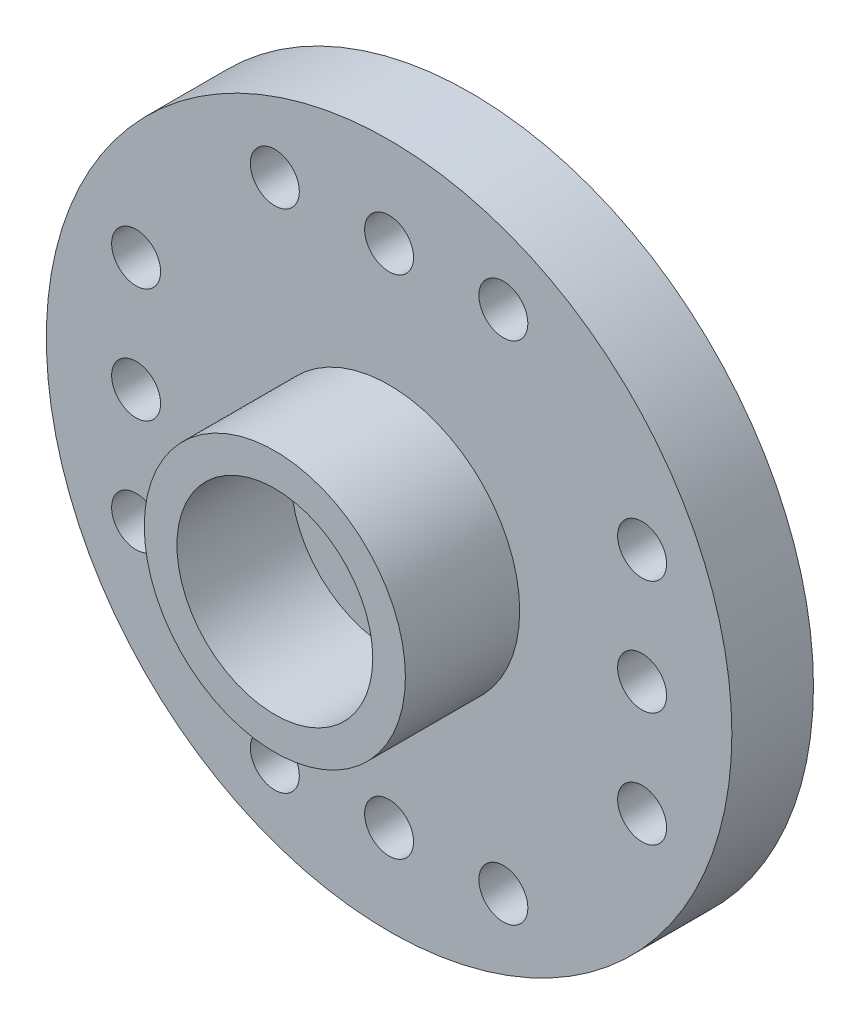
ISO-10303-21;
HEADER;
FILE_DESCRIPTION(('STEP AP214'),'2;1');
FILE_NAME('part.step','',(''),(''),'','','');
FILE_SCHEMA(('AUTOMOTIVE_DESIGN { 1 0 10303 214 1 1 1 1 }'));
ENDSEC;
DATA;
#1=APPLICATION_CONTEXT('core data for automotive mechanical design processes');
#2=APPLICATION_PROTOCOL_DEFINITION('international standard','automotive_design',2000,#1);
#3=PRODUCT_CONTEXT('',#1,'mechanical');
#4=PRODUCT('Part','Part','',(#3));
#5=PRODUCT_RELATED_PRODUCT_CATEGORY('part','',(#4));
#6=PRODUCT_DEFINITION_FORMATION('','',#4);
#7=PRODUCT_DEFINITION_CONTEXT('part definition',#1,'design');
#8=PRODUCT_DEFINITION('design','',#6,#7);
#9=PRODUCT_DEFINITION_SHAPE('','',#8);
#10=(LENGTH_UNIT() NAMED_UNIT(*) SI_UNIT(.MILLI.,.METRE.));
#11=(NAMED_UNIT(*) PLANE_ANGLE_UNIT() SI_UNIT($,.RADIAN.));
#12=(NAMED_UNIT(*) SI_UNIT($,.STERADIAN.) SOLID_ANGLE_UNIT());
#13=UNCERTAINTY_MEASURE_WITH_UNIT(LENGTH_MEASURE(1.E-05),#10,'distance_accuracy_value','');
#14=(GEOMETRIC_REPRESENTATION_CONTEXT(3) GLOBAL_UNCERTAINTY_ASSIGNED_CONTEXT((#13)) GLOBAL_UNIT_ASSIGNED_CONTEXT((#10,
#11,#12)) REPRESENTATION_CONTEXT('',''));
#15=CARTESIAN_POINT('',(0.,0.,0.));
#16=DIRECTION('',(0.,0.,1.));
#17=DIRECTION('',(1.,0.,0.));
#18=AXIS2_PLACEMENT_3D('',#15,#16,#17);
#19=CARTESIAN_POINT('',(0.,0.,2.5));
#20=DIRECTION('',(0.,0.,1.));
#21=DIRECTION('',(1.,0.,0.));
#22=AXIS2_PLACEMENT_3D('',#19,#20,#21);
#23=PLANE('',#22);
#24=CARTESIAN_POINT('',(3.50000000000032,-7.74999999999988,2.5));
#25=DIRECTION('',(0.,0.,1.));
#26=DIRECTION('',(1.,0.,0.));
#27=AXIS2_PLACEMENT_3D('',#24,#25,#26);
#28=CIRCLE('',#27,0.749999999999969);
#29=CARTESIAN_POINT('',(4.25000000000029,-7.74999999999988,2.5));
#30=VERTEX_POINT('',#29);
#31=EDGE_CURVE('E99',#30,#30,#28,.T.);
#32=ORIENTED_EDGE('',*,*,#31,.F.);
#33=EDGE_LOOP('',(#32));
#34=FACE_BOUND('',#33,.T.);
#35=CARTESIAN_POINT('',(-3.49999999999968,-7.74999999999988,2.5));
#36=DIRECTION('',(0.,0.,1.));
#37=DIRECTION('',(1.,0.,0.));
#38=AXIS2_PLACEMENT_3D('',#35,#36,#37);
#39=CIRCLE('',#38,0.75000000000004);
#40=CARTESIAN_POINT('',(-2.74999999999964,-7.74999999999988,2.5));
#41=VERTEX_POINT('',#40);
#42=EDGE_CURVE('E89',#41,#41,#39,.T.);
#43=ORIENTED_EDGE('',*,*,#42,.F.);
#44=EDGE_LOOP('',(#43));
#45=FACE_BOUND('',#44,.T.);
#46=CARTESIAN_POINT('',(3.18526106670121E-13,-7.74999999999988,2.5));
#47=DIRECTION('',(0.,0.,1.));
#48=DIRECTION('',(1.,0.,0.));
#49=AXIS2_PLACEMENT_3D('',#46,#47,#48);
#50=CIRCLE('',#49,0.750000000000005);
#51=CARTESIAN_POINT('',(0.750000000000323,-7.74999999999988,2.5));
#52=VERTEX_POINT('',#51);
#53=EDGE_CURVE('E86',#52,#52,#50,.T.);
#54=ORIENTED_EDGE('',*,*,#53,.F.);
#55=EDGE_LOOP('',(#54));
#56=FACE_BOUND('',#55,.T.);
#57=CARTESIAN_POINT('',(7.7500000000002,3.50000000000043,2.5));
#58=DIRECTION('',(0.,0.,1.));
#59=DIRECTION('',(1.,0.,0.));
#60=AXIS2_PLACEMENT_3D('',#57,#58,#59);
#61=CIRCLE('',#60,0.750000000000311);
#62=CARTESIAN_POINT('',(8.50000000000051,3.50000000000043,2.5));
#63=VERTEX_POINT('',#62);
#64=EDGE_CURVE('E83',#63,#63,#61,.T.);
#65=ORIENTED_EDGE('',*,*,#64,.F.);
#66=EDGE_LOOP('',(#65));
#67=FACE_BOUND('',#66,.T.);
#68=CARTESIAN_POINT('',(7.7500000000002,-3.49999999999957,2.5));
#69=DIRECTION('',(0.,0.,1.));
#70=DIRECTION('',(1.,0.,0.));
#71=AXIS2_PLACEMENT_3D('',#68,#69,#70);
#72=CIRCLE('',#71,0.750000000000357);
#73=CARTESIAN_POINT('',(8.50000000000056,-3.49999999999957,2.5));
#74=VERTEX_POINT('',#73);
#75=EDGE_CURVE('E79',#74,#74,#72,.T.);
#76=ORIENTED_EDGE('',*,*,#75,.F.);
#77=EDGE_LOOP('',(#76));
#78=FACE_BOUND('',#77,.T.);
#79=CARTESIAN_POINT('',(7.7500000000002,4.34711709794892E-13,2.5));
#80=DIRECTION('',(0.,0.,1.));
#81=DIRECTION('',(1.,0.,0.));
#82=AXIS2_PLACEMENT_3D('',#79,#80,#81);
#83=CIRCLE('',#82,0.750000000000334);
#84=CARTESIAN_POINT('',(8.50000000000053,4.34711709794892E-13,2.5));
#85=VERTEX_POINT('',#84);
#86=EDGE_CURVE('E75',#85,#85,#83,.T.);
#87=ORIENTED_EDGE('',*,*,#86,.F.);
#88=EDGE_LOOP('',(#87));
#89=FACE_BOUND('',#88,.T.);
#90=CARTESIAN_POINT('',(-3.50000000000012,7.75000000000032,2.5));
#91=DIRECTION('',(0.,0.,1.));
#92=DIRECTION('',(1.,0.,0.));
#93=AXIS2_PLACEMENT_3D('',#90,#91,#92);
#94=CIRCLE('',#93,0.750000000000333);
#95=CARTESIAN_POINT('',(-2.74999999999979,7.75000000000032,2.5));
#96=VERTEX_POINT('',#95);
#97=EDGE_CURVE('E71',#96,#96,#94,.T.);
#98=ORIENTED_EDGE('',*,*,#97,.F.);
#99=EDGE_LOOP('',(#98));
#100=FACE_BOUND('',#99,.T.);
#101=CARTESIAN_POINT('',(3.49999999999988,7.75000000000032,2.5));
#102=DIRECTION('',(0.,0.,1.));
#103=DIRECTION('',(1.,0.,0.));
#104=AXIS2_PLACEMENT_3D('',#101,#102,#103);
#105=CIRCLE('',#104,0.750000000000357);
#106=CARTESIAN_POINT('',(4.25000000000024,7.75000000000032,2.5));
#107=VERTEX_POINT('',#106);
#108=EDGE_CURVE('E67',#107,#107,#105,.T.);
#109=ORIENTED_EDGE('',*,*,#108,.F.);
#110=EDGE_LOOP('',(#109));
#111=FACE_BOUND('',#110,.T.);
#112=CARTESIAN_POINT('',(-1.18083805663449E-13,7.75000000000032,2.5));
#113=DIRECTION('',(0.,0.,1.));
#114=DIRECTION('',(1.,0.,0.));
#115=AXIS2_PLACEMENT_3D('',#112,#113,#114);
#116=CIRCLE('',#115,0.750000000000345);
#117=CARTESIAN_POINT('',(0.750000000000227,7.75000000000032,2.5));
#118=VERTEX_POINT('',#117);
#119=EDGE_CURVE('E63',#118,#118,#116,.T.);
#120=ORIENTED_EDGE('',*,*,#119,.F.);
#121=EDGE_LOOP('',(#120));
#122=FACE_BOUND('',#121,.T.);
#123=CARTESIAN_POINT('',(-7.75,-3.5,2.5));
#124=DIRECTION('',(0.,0.,1.));
#125=DIRECTION('',(1.,0.,0.));
#126=AXIS2_PLACEMENT_3D('',#123,#124,#125);
#127=CIRCLE('',#126,0.75);
#128=CARTESIAN_POINT('',(-7.,-3.5,2.5));
#129=VERTEX_POINT('',#128);
#130=EDGE_CURVE('E59',#129,#129,#127,.T.);
#131=ORIENTED_EDGE('',*,*,#130,.F.);
#132=EDGE_LOOP('',(#131));
#133=FACE_BOUND('',#132,.T.);
#134=CARTESIAN_POINT('',(-7.75,3.5,2.5));
#135=DIRECTION('',(0.,0.,1.));
#136=DIRECTION('',(1.,0.,0.));
#137=AXIS2_PLACEMENT_3D('',#134,#135,#136);
#138=CIRCLE('',#137,0.75);
#139=CARTESIAN_POINT('',(-7.,3.5,2.5));
#140=VERTEX_POINT('',#139);
#141=EDGE_CURVE('E55',#140,#140,#138,.T.);
#142=ORIENTED_EDGE('',*,*,#141,.F.);
#143=EDGE_LOOP('',(#142));
#144=FACE_BOUND('',#143,.T.);
#145=CARTESIAN_POINT('',(-7.75,0.,2.5));
#146=DIRECTION('',(0.,0.,1.));
#147=DIRECTION('',(1.,0.,0.));
#148=AXIS2_PLACEMENT_3D('',#145,#146,#147);
#149=CIRCLE('',#148,0.75);
#150=CARTESIAN_POINT('',(-7.,0.,2.5));
#151=VERTEX_POINT('',#150);
#152=EDGE_CURVE('E51',#151,#151,#149,.T.);
#153=ORIENTED_EDGE('',*,*,#152,.F.);
#154=EDGE_LOOP('',(#153));
#155=FACE_BOUND('',#154,.T.);
#156=CARTESIAN_POINT('',(0.,0.,2.5));
#157=DIRECTION('',(0.,0.,1.));
#158=DIRECTION('',(1.,0.,0.));
#159=AXIS2_PLACEMENT_3D('',#156,#157,#158);
#160=CIRCLE('',#159,10.5);
#161=CARTESIAN_POINT('',(10.5,0.,2.5));
#162=VERTEX_POINT('',#161);
#163=EDGE_CURVE('E38',#162,#162,#160,.T.);
#164=ORIENTED_EDGE('',*,*,#163,.T.);
#165=EDGE_LOOP('',(#164));
#166=FACE_BOUND('',#165,.T.);
#167=CARTESIAN_POINT('',(0.,0.,2.5));
#168=DIRECTION('',(0.,0.,1.));
#169=DIRECTION('',(1.,0.,0.));
#170=AXIS2_PLACEMENT_3D('',#167,#168,#169);
#171=CIRCLE('',#170,4.);
#172=CARTESIAN_POINT('',(4.,0.,2.5));
#173=VERTEX_POINT('',#172);
#174=EDGE_CURVE('E122',#173,#173,#171,.T.);
#175=ORIENTED_EDGE('',*,*,#174,.F.);
#176=EDGE_LOOP('',(#175));
#177=FACE_BOUND('',#176,.T.);
#178=ADVANCED_FACE('F30',(#34,#45,#56,#67,#78,#89,#100,#111,#122,#133,#144,#155,#166,#177),#23,.T.);
#179=CARTESIAN_POINT('',(0.,0.,2.5));
#180=DIRECTION('',(0.,0.,1.));
#181=DIRECTION('',(1.,0.,0.));
#182=AXIS2_PLACEMENT_3D('',#179,#180,#181);
#183=CIRCLE('',#182,3.);
#184=CARTESIAN_POINT('',(3.,0.,2.5));
#185=VERTEX_POINT('',#184);
#186=EDGE_CURVE('E10',#185,#185,#183,.F.);
#187=ORIENTED_EDGE('',*,*,#186,.F.);
#188=EDGE_LOOP('',(#187));
#189=FACE_BOUND('',#188,.T.);
#190=CARTESIAN_POINT('',(0.,0.,2.5));
#191=DIRECTION('',(0.,0.,1.));
#192=DIRECTION('',(1.,0.,0.));
#193=AXIS2_PLACEMENT_3D('',#190,#191,#192);
#194=CIRCLE('',#193,1.5);
#195=CARTESIAN_POINT('',(1.5,0.,2.5));
#196=VERTEX_POINT('',#195);
#197=EDGE_CURVE('E129',#196,#196,#194,.T.);
#198=ORIENTED_EDGE('',*,*,#197,.F.);
#199=EDGE_LOOP('',(#198));
#200=FACE_BOUND('',#199,.T.);
#201=ADVANCED_FACE('F153',(#189,#200),#23,.T.);
#202=CARTESIAN_POINT('',(0.,0.,0.));
#203=DIRECTION('',(0.,0.,1.));
#204=DIRECTION('',(1.,0.,0.));
#205=AXIS2_PLACEMENT_3D('',#202,#203,#204);
#206=PLANE('',#205);
#207=CARTESIAN_POINT('',(3.50000000000032,-7.74999999999988,0.));
#208=DIRECTION('',(0.,0.,1.));
#209=DIRECTION('',(1.,0.,0.));
#210=AXIS2_PLACEMENT_3D('',#207,#208,#209);
#211=CIRCLE('',#210,0.749999999999969);
#212=CARTESIAN_POINT('',(4.25000000000029,-7.74999999999988,0.));
#213=VERTEX_POINT('',#212);
#214=EDGE_CURVE('E34',#213,#213,#211,.T.);
#215=ORIENTED_EDGE('',*,*,#214,.T.);
#216=EDGE_LOOP('',(#215));
#217=FACE_BOUND('',#216,.T.);
#218=CARTESIAN_POINT('',(-3.49999999999968,-7.74999999999988,0.));
#219=DIRECTION('',(0.,0.,1.));
#220=DIRECTION('',(1.,0.,0.));
#221=AXIS2_PLACEMENT_3D('',#218,#219,#220);
#222=CIRCLE('',#221,0.75000000000004);
#223=CARTESIAN_POINT('',(-2.74999999999964,-7.74999999999988,0.));
#224=VERTEX_POINT('',#223);
#225=EDGE_CURVE('E87',#224,#224,#222,.T.);
#226=ORIENTED_EDGE('',*,*,#225,.T.);
#227=EDGE_LOOP('',(#226));
#228=FACE_BOUND('',#227,.T.);
#229=CARTESIAN_POINT('',(3.18526106670121E-13,-7.74999999999988,0.));
#230=DIRECTION('',(0.,0.,1.));
#231=DIRECTION('',(1.,0.,0.));
#232=AXIS2_PLACEMENT_3D('',#229,#230,#231);
#233=CIRCLE('',#232,0.750000000000005);
#234=CARTESIAN_POINT('',(0.750000000000323,-7.74999999999988,0.));
#235=VERTEX_POINT('',#234);
#236=EDGE_CURVE('E84',#235,#235,#233,.T.);
#237=ORIENTED_EDGE('',*,*,#236,.T.);
#238=EDGE_LOOP('',(#237));
#239=FACE_BOUND('',#238,.T.);
#240=CARTESIAN_POINT('',(7.7500000000002,3.50000000000043,0.));
#241=DIRECTION('',(0.,0.,1.));
#242=DIRECTION('',(1.,0.,0.));
#243=AXIS2_PLACEMENT_3D('',#240,#241,#242);
#244=CIRCLE('',#243,0.750000000000311);
#245=CARTESIAN_POINT('',(8.50000000000051,3.50000000000043,0.));
#246=VERTEX_POINT('',#245);
#247=EDGE_CURVE('E80',#246,#246,#244,.T.);
#248=ORIENTED_EDGE('',*,*,#247,.T.);
#249=EDGE_LOOP('',(#248));
#250=FACE_BOUND('',#249,.T.);
#251=CARTESIAN_POINT('',(7.7500000000002,-3.49999999999957,0.));
#252=DIRECTION('',(0.,0.,1.));
#253=DIRECTION('',(1.,0.,0.));
#254=AXIS2_PLACEMENT_3D('',#251,#252,#253);
#255=CIRCLE('',#254,0.750000000000357);
#256=CARTESIAN_POINT('',(8.50000000000056,-3.49999999999957,0.));
#257=VERTEX_POINT('',#256);
#258=EDGE_CURVE('E76',#257,#257,#255,.T.);
#259=ORIENTED_EDGE('',*,*,#258,.T.);
#260=EDGE_LOOP('',(#259));
#261=FACE_BOUND('',#260,.T.);
#262=CARTESIAN_POINT('',(7.7500000000002,4.34711709794892E-13,0.));
#263=DIRECTION('',(0.,0.,1.));
#264=DIRECTION('',(1.,0.,0.));
#265=AXIS2_PLACEMENT_3D('',#262,#263,#264);
#266=CIRCLE('',#265,0.750000000000334);
#267=CARTESIAN_POINT('',(8.50000000000053,4.34711709794892E-13,0.));
#268=VERTEX_POINT('',#267);
#269=EDGE_CURVE('E72',#268,#268,#266,.T.);
#270=ORIENTED_EDGE('',*,*,#269,.T.);
#271=EDGE_LOOP('',(#270));
#272=FACE_BOUND('',#271,.T.);
#273=CARTESIAN_POINT('',(-3.50000000000012,7.75000000000032,0.));
#274=DIRECTION('',(0.,0.,1.));
#275=DIRECTION('',(1.,0.,0.));
#276=AXIS2_PLACEMENT_3D('',#273,#274,#275);
#277=CIRCLE('',#276,0.750000000000333);
#278=CARTESIAN_POINT('',(-2.74999999999979,7.75000000000032,0.));
#279=VERTEX_POINT('',#278);
#280=EDGE_CURVE('E68',#279,#279,#277,.T.);
#281=ORIENTED_EDGE('',*,*,#280,.T.);
#282=EDGE_LOOP('',(#281));
#283=FACE_BOUND('',#282,.T.);
#284=CARTESIAN_POINT('',(3.49999999999988,7.75000000000032,0.));
#285=DIRECTION('',(0.,0.,1.));
#286=DIRECTION('',(1.,0.,0.));
#287=AXIS2_PLACEMENT_3D('',#284,#285,#286);
#288=CIRCLE('',#287,0.750000000000357);
#289=CARTESIAN_POINT('',(4.25000000000024,7.75000000000032,0.));
#290=VERTEX_POINT('',#289);
#291=EDGE_CURVE('E64',#290,#290,#288,.T.);
#292=ORIENTED_EDGE('',*,*,#291,.T.);
#293=EDGE_LOOP('',(#292));
#294=FACE_BOUND('',#293,.T.);
#295=CARTESIAN_POINT('',(-1.18083805663449E-13,7.75000000000032,0.));
#296=DIRECTION('',(0.,0.,1.));
#297=DIRECTION('',(1.,0.,0.));
#298=AXIS2_PLACEMENT_3D('',#295,#296,#297);
#299=CIRCLE('',#298,0.750000000000345);
#300=CARTESIAN_POINT('',(0.750000000000227,7.75000000000032,0.));
#301=VERTEX_POINT('',#300);
#302=EDGE_CURVE('E60',#301,#301,#299,.T.);
#303=ORIENTED_EDGE('',*,*,#302,.T.);
#304=EDGE_LOOP('',(#303));
#305=FACE_BOUND('',#304,.T.);
#306=CARTESIAN_POINT('',(-7.75,-3.5,0.));
#307=DIRECTION('',(0.,0.,1.));
#308=DIRECTION('',(1.,0.,0.));
#309=AXIS2_PLACEMENT_3D('',#306,#307,#308);
#310=CIRCLE('',#309,0.75);
#311=CARTESIAN_POINT('',(-7.,-3.5,0.));
#312=VERTEX_POINT('',#311);
#313=EDGE_CURVE('E56',#312,#312,#310,.T.);
#314=ORIENTED_EDGE('',*,*,#313,.T.);
#315=EDGE_LOOP('',(#314));
#316=FACE_BOUND('',#315,.T.);
#317=CARTESIAN_POINT('',(-7.75,3.5,0.));
#318=DIRECTION('',(0.,0.,1.));
#319=DIRECTION('',(1.,0.,0.));
#320=AXIS2_PLACEMENT_3D('',#317,#318,#319);
#321=CIRCLE('',#320,0.75);
#322=CARTESIAN_POINT('',(-7.,3.5,0.));
#323=VERTEX_POINT('',#322);
#324=EDGE_CURVE('E52',#323,#323,#321,.T.);
#325=ORIENTED_EDGE('',*,*,#324,.T.);
#326=EDGE_LOOP('',(#325));
#327=FACE_BOUND('',#326,.T.);
#328=CARTESIAN_POINT('',(-7.75,0.,0.));
#329=DIRECTION('',(0.,0.,1.));
#330=DIRECTION('',(1.,0.,0.));
#331=AXIS2_PLACEMENT_3D('',#328,#329,#330);
#332=CIRCLE('',#331,0.75);
#333=CARTESIAN_POINT('',(-7.,0.,0.));
#334=VERTEX_POINT('',#333);
#335=EDGE_CURVE('E47',#334,#334,#332,.T.);
#336=ORIENTED_EDGE('',*,*,#335,.T.);
#337=EDGE_LOOP('',(#336));
#338=FACE_BOUND('',#337,.T.);
#339=CARTESIAN_POINT('',(0.,0.,0.));
#340=DIRECTION('',(0.,0.,1.));
#341=DIRECTION('',(1.,0.,0.));
#342=AXIS2_PLACEMENT_3D('',#339,#340,#341);
#343=CIRCLE('',#342,10.5);
#344=CARTESIAN_POINT('',(10.5,0.,0.));
#345=VERTEX_POINT('',#344);
#346=EDGE_CURVE('E43',#345,#345,#343,.T.);
#347=ORIENTED_EDGE('',*,*,#346,.F.);
#348=EDGE_LOOP('',(#347));
#349=FACE_BOUND('',#348,.T.);
#350=CARTESIAN_POINT('',(0.,0.,0.));
#351=DIRECTION('',(0.,0.,1.));
#352=DIRECTION('',(1.,0.,0.));
#353=AXIS2_PLACEMENT_3D('',#350,#351,#352);
#354=CIRCLE('',#353,1.5);
#355=CARTESIAN_POINT('',(1.5,0.,0.));
#356=VERTEX_POINT('',#355);
#357=EDGE_CURVE('E126',#356,#356,#354,.T.);
#358=ORIENTED_EDGE('',*,*,#357,.T.);
#359=EDGE_LOOP('',(#358));
#360=FACE_BOUND('',#359,.T.);
#361=ADVANCED_FACE('F135',(#217,#228,#239,#250,#261,#272,#283,#294,#305,#316,#327,#338,#349,
#360),#206,.F.);
#362=CARTESIAN_POINT('',(0.,0.,2.5));
#363=DIRECTION('',(0.,0.,-1.));
#364=DIRECTION('',(-1.,0.,0.));
#365=AXIS2_PLACEMENT_3D('',#362,#363,#364);
#366=CYLINDRICAL_SURFACE('',#365,10.5);
#367=ORIENTED_EDGE('',*,*,#163,.F.);
#368=EDGE_LOOP('',(#367));
#369=FACE_BOUND('',#368,.T.);
#370=ORIENTED_EDGE('',*,*,#346,.T.);
#371=EDGE_LOOP('',(#370));
#372=FACE_BOUND('',#371,.T.);
#373=ADVANCED_FACE('F32',(#369,#372),#366,.T.);
#374=CARTESIAN_POINT('',(0.,0.,2.5));
#375=DIRECTION('',(0.,0.,-1.));
#376=DIRECTION('',(-1.,0.,0.));
#377=AXIS2_PLACEMENT_3D('',#374,#375,#376);
#378=CYLINDRICAL_SURFACE('',#377,1.5);
#379=ORIENTED_EDGE('',*,*,#197,.T.);
#380=EDGE_LOOP('',(#379));
#381=FACE_BOUND('',#380,.T.);
#382=ORIENTED_EDGE('',*,*,#357,.F.);
#383=EDGE_LOOP('',(#382));
#384=FACE_BOUND('',#383,.T.);
#385=ADVANCED_FACE('F137',(#381,#384),#378,.F.);
#386=CARTESIAN_POINT('',(0.,0.,6.));
#387=DIRECTION('',(0.,0.,1.));
#388=DIRECTION('',(1.,0.,0.));
#389=AXIS2_PLACEMENT_3D('',#386,#387,#388);
#390=PLANE('',#389);
#391=CARTESIAN_POINT('',(0.,0.,6.));
#392=DIRECTION('',(0.,0.,1.));
#393=DIRECTION('',(1.,0.,0.));
#394=AXIS2_PLACEMENT_3D('',#391,#392,#393);
#395=CIRCLE('',#394,4.);
#396=CARTESIAN_POINT('',(4.,0.,6.));
#397=VERTEX_POINT('',#396);
#398=EDGE_CURVE('E123',#397,#397,#395,.T.);
#399=ORIENTED_EDGE('',*,*,#398,.T.);
#400=EDGE_LOOP('',(#399));
#401=FACE_BOUND('',#400,.T.);
#402=CARTESIAN_POINT('',(0.,0.,6.));
#403=DIRECTION('',(0.,0.,1.));
#404=DIRECTION('',(1.,0.,0.));
#405=AXIS2_PLACEMENT_3D('',#402,#403,#404);
#406=CIRCLE('',#405,3.);
#407=CARTESIAN_POINT('',(3.,0.,6.));
#408=VERTEX_POINT('',#407);
#409=EDGE_CURVE('E50',#408,#408,#406,.T.);
#410=ORIENTED_EDGE('',*,*,#409,.F.);
#411=EDGE_LOOP('',(#410));
#412=FACE_BOUND('',#411,.T.);
#413=ADVANCED_FACE('F139',(#401,#412),#390,.T.);
#414=CARTESIAN_POINT('',(0.,0.,6.));
#415=DIRECTION('',(0.,0.,-1.));
#416=DIRECTION('',(-1.,0.,0.));
#417=AXIS2_PLACEMENT_3D('',#414,#415,#416);
#418=CYLINDRICAL_SURFACE('',#417,4.);
#419=ORIENTED_EDGE('',*,*,#398,.F.);
#420=EDGE_LOOP('',(#419));
#421=FACE_BOUND('',#420,.T.);
#422=ORIENTED_EDGE('',*,*,#174,.T.);
#423=EDGE_LOOP('',(#422));
#424=FACE_BOUND('',#423,.T.);
#425=ADVANCED_FACE('F146',(#421,#424),#418,.T.);
#426=CARTESIAN_POINT('',(0.,0.,6.));
#427=DIRECTION('',(0.,0.,-1.));
#428=DIRECTION('',(-1.,0.,0.));
#429=AXIS2_PLACEMENT_3D('',#426,#427,#428);
#430=CYLINDRICAL_SURFACE('',#429,3.);
#431=ORIENTED_EDGE('',*,*,#409,.T.);
#432=EDGE_LOOP('',(#431));
#433=FACE_BOUND('',#432,.T.);
#434=ORIENTED_EDGE('',*,*,#186,.T.);
#435=EDGE_LOOP('',(#434));
#436=FACE_BOUND('',#435,.T.);
#437=ADVANCED_FACE('F194',(#433,#436),#430,.F.);
#438=CARTESIAN_POINT('',(-7.75,0.,-1.));
#439=DIRECTION('',(0.,0.,1.));
#440=DIRECTION('',(1.,0.,0.));
#441=AXIS2_PLACEMENT_3D('',#438,#439,#440);
#442=CYLINDRICAL_SURFACE('',#441,0.75);
#443=ORIENTED_EDGE('',*,*,#152,.T.);
#444=EDGE_LOOP('',(#443));
#445=FACE_BOUND('',#444,.T.);
#446=ORIENTED_EDGE('',*,*,#335,.F.);
#447=EDGE_LOOP('',(#446));
#448=FACE_BOUND('',#447,.T.);
#449=ADVANCED_FACE('F191',(#445,#448),#442,.F.);
#450=CARTESIAN_POINT('',(-7.75,3.5,-1.));
#451=DIRECTION('',(0.,0.,1.));
#452=DIRECTION('',(1.,0.,0.));
#453=AXIS2_PLACEMENT_3D('',#450,#451,#452);
#454=CYLINDRICAL_SURFACE('',#453,0.75);
#455=ORIENTED_EDGE('',*,*,#141,.T.);
#456=EDGE_LOOP('',(#455));
#457=FACE_BOUND('',#456,.T.);
#458=ORIENTED_EDGE('',*,*,#324,.F.);
#459=EDGE_LOOP('',(#458));
#460=FACE_BOUND('',#459,.T.);
#461=ADVANCED_FACE('F193',(#457,#460),#454,.F.);
#462=CARTESIAN_POINT('',(-7.75,-3.5,-1.));
#463=DIRECTION('',(0.,0.,1.));
#464=DIRECTION('',(1.,0.,0.));
#465=AXIS2_PLACEMENT_3D('',#462,#463,#464);
#466=CYLINDRICAL_SURFACE('',#465,0.75);
#467=ORIENTED_EDGE('',*,*,#130,.T.);
#468=EDGE_LOOP('',(#467));
#469=FACE_BOUND('',#468,.T.);
#470=ORIENTED_EDGE('',*,*,#313,.F.);
#471=EDGE_LOOP('',(#470));
#472=FACE_BOUND('',#471,.T.);
#473=ADVANCED_FACE('F201',(#469,#472),#466,.F.);
#474=CARTESIAN_POINT('',(-1.18083805663449E-13,7.75000000000032,-1.));
#475=DIRECTION('',(0.,0.,1.));
#476=DIRECTION('',(1.,0.,0.));
#477=AXIS2_PLACEMENT_3D('',#474,#475,#476);
#478=CYLINDRICAL_SURFACE('',#477,0.750000000000345);
#479=ORIENTED_EDGE('',*,*,#119,.T.);
#480=EDGE_LOOP('',(#479));
#481=FACE_BOUND('',#480,.T.);
#482=ORIENTED_EDGE('',*,*,#302,.F.);
#483=EDGE_LOOP('',(#482));
#484=FACE_BOUND('',#483,.T.);
#485=ADVANCED_FACE('F254',(#481,#484),#478,.F.);
#486=CARTESIAN_POINT('',(3.49999999999988,7.75000000000032,-1.));
#487=DIRECTION('',(0.,0.,1.));
#488=DIRECTION('',(1.,0.,0.));
#489=AXIS2_PLACEMENT_3D('',#486,#487,#488);
#490=CYLINDRICAL_SURFACE('',#489,0.750000000000357);
#491=ORIENTED_EDGE('',*,*,#108,.T.);
#492=EDGE_LOOP('',(#491));
#493=FACE_BOUND('',#492,.T.);
#494=ORIENTED_EDGE('',*,*,#291,.F.);
#495=EDGE_LOOP('',(#494));
#496=FACE_BOUND('',#495,.T.);
#497=ADVANCED_FACE('F263',(#493,#496),#490,.F.);
#498=CARTESIAN_POINT('',(-3.50000000000012,7.75000000000032,-1.));
#499=DIRECTION('',(0.,0.,1.));
#500=DIRECTION('',(1.,0.,0.));
#501=AXIS2_PLACEMENT_3D('',#498,#499,#500);
#502=CYLINDRICAL_SURFACE('',#501,0.750000000000333);
#503=ORIENTED_EDGE('',*,*,#97,.T.);
#504=EDGE_LOOP('',(#503));
#505=FACE_BOUND('',#504,.T.);
#506=ORIENTED_EDGE('',*,*,#280,.F.);
#507=EDGE_LOOP('',(#506));
#508=FACE_BOUND('',#507,.T.);
#509=ADVANCED_FACE('F273',(#505,#508),#502,.F.);
#510=CARTESIAN_POINT('',(7.7500000000002,4.34711709794892E-13,-1.));
#511=DIRECTION('',(0.,0.,1.));
#512=DIRECTION('',(1.,0.,0.));
#513=AXIS2_PLACEMENT_3D('',#510,#511,#512);
#514=CYLINDRICAL_SURFACE('',#513,0.750000000000334);
#515=ORIENTED_EDGE('',*,*,#86,.T.);
#516=EDGE_LOOP('',(#515));
#517=FACE_BOUND('',#516,.T.);
#518=ORIENTED_EDGE('',*,*,#269,.F.);
#519=EDGE_LOOP('',(#518));
#520=FACE_BOUND('',#519,.T.);
#521=ADVANCED_FACE('F283',(#517,#520),#514,.F.);
#522=CARTESIAN_POINT('',(7.7500000000002,-3.49999999999957,-1.));
#523=DIRECTION('',(0.,0.,1.));
#524=DIRECTION('',(1.,0.,0.));
#525=AXIS2_PLACEMENT_3D('',#522,#523,#524);
#526=CYLINDRICAL_SURFACE('',#525,0.750000000000357);
#527=ORIENTED_EDGE('',*,*,#75,.T.);
#528=EDGE_LOOP('',(#527));
#529=FACE_BOUND('',#528,.T.);
#530=ORIENTED_EDGE('',*,*,#258,.F.);
#531=EDGE_LOOP('',(#530));
#532=FACE_BOUND('',#531,.T.);
#533=ADVANCED_FACE('F293',(#529,#532),#526,.F.);
#534=CARTESIAN_POINT('',(7.7500000000002,3.50000000000043,-1.));
#535=DIRECTION('',(0.,0.,1.));
#536=DIRECTION('',(1.,0.,0.));
#537=AXIS2_PLACEMENT_3D('',#534,#535,#536);
#538=CYLINDRICAL_SURFACE('',#537,0.750000000000311);
#539=ORIENTED_EDGE('',*,*,#64,.T.);
#540=EDGE_LOOP('',(#539));
#541=FACE_BOUND('',#540,.T.);
#542=ORIENTED_EDGE('',*,*,#247,.F.);
#543=EDGE_LOOP('',(#542));
#544=FACE_BOUND('',#543,.T.);
#545=ADVANCED_FACE('F303',(#541,#544),#538,.F.);
#546=CARTESIAN_POINT('',(3.18526106670121E-13,-7.74999999999988,-1.));
#547=DIRECTION('',(0.,0.,1.));
#548=DIRECTION('',(1.,0.,0.));
#549=AXIS2_PLACEMENT_3D('',#546,#547,#548);
#550=CYLINDRICAL_SURFACE('',#549,0.750000000000005);
#551=ORIENTED_EDGE('',*,*,#53,.T.);
#552=EDGE_LOOP('',(#551));
#553=FACE_BOUND('',#552,.T.);
#554=ORIENTED_EDGE('',*,*,#236,.F.);
#555=EDGE_LOOP('',(#554));
#556=FACE_BOUND('',#555,.T.);
#557=ADVANCED_FACE('F313',(#553,#556),#550,.F.);
#558=CARTESIAN_POINT('',(-3.49999999999968,-7.74999999999988,-1.));
#559=DIRECTION('',(0.,0.,1.));
#560=DIRECTION('',(1.,0.,0.));
#561=AXIS2_PLACEMENT_3D('',#558,#559,#560);
#562=CYLINDRICAL_SURFACE('',#561,0.75000000000004);
#563=ORIENTED_EDGE('',*,*,#42,.T.);
#564=EDGE_LOOP('',(#563));
#565=FACE_BOUND('',#564,.T.);
#566=ORIENTED_EDGE('',*,*,#225,.F.);
#567=EDGE_LOOP('',(#566));
#568=FACE_BOUND('',#567,.T.);
#569=ADVANCED_FACE('F323',(#565,#568),#562,.F.);
#570=CARTESIAN_POINT('',(3.50000000000032,-7.74999999999988,-1.));
#571=DIRECTION('',(0.,0.,1.));
#572=DIRECTION('',(1.,0.,0.));
#573=AXIS2_PLACEMENT_3D('',#570,#571,#572);
#574=CYLINDRICAL_SURFACE('',#573,0.749999999999969);
#575=ORIENTED_EDGE('',*,*,#31,.T.);
#576=EDGE_LOOP('',(#575));
#577=FACE_BOUND('',#576,.T.);
#578=ORIENTED_EDGE('',*,*,#214,.F.);
#579=EDGE_LOOP('',(#578));
#580=FACE_BOUND('',#579,.T.);
#581=ADVANCED_FACE('F333',(#577,#580),#574,.F.);
#582=CLOSED_SHELL('',(#178,#201,#361,#373,#385,#413,#425,#437,#449,#461,#473,#485,#497,#509,
#521,#533,#545,#557,#569,#581));
#583=MANIFOLD_SOLID_BREP('B2',#582);
#584=ADVANCED_BREP_SHAPE_REPRESENTATION('',(#18,#583),#14);
#585=SHAPE_DEFINITION_REPRESENTATION(#9,#584);
ENDSEC;
END-ISO-10303-21;
